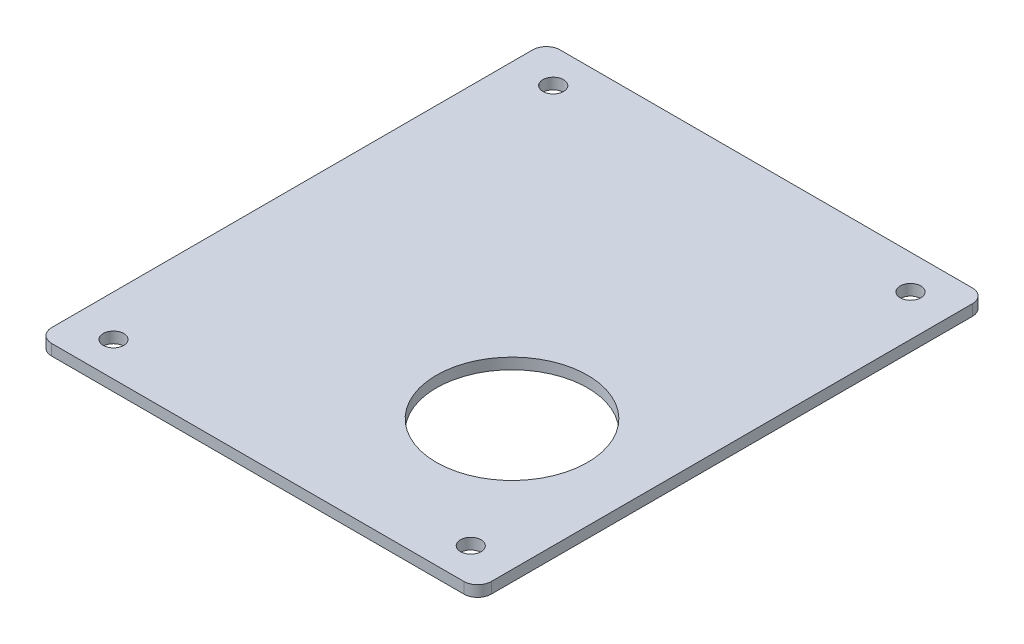
ISO-10303-21;
HEADER;
FILE_DESCRIPTION(('STEP AP214'),'2;1');
FILE_NAME('part.step','',(''),(''),'','','');
FILE_SCHEMA(('AUTOMOTIVE_DESIGN { 1 0 10303 214 1 1 1 1 }'));
ENDSEC;
DATA;
#1=APPLICATION_CONTEXT('core data for automotive mechanical design processes');
#2=APPLICATION_PROTOCOL_DEFINITION('international standard','automotive_design',2000,#1);
#3=PRODUCT_CONTEXT('',#1,'mechanical');
#4=PRODUCT('Part','Part','',(#3));
#5=PRODUCT_RELATED_PRODUCT_CATEGORY('part','',(#4));
#6=PRODUCT_DEFINITION_FORMATION('','',#4);
#7=PRODUCT_DEFINITION_CONTEXT('part definition',#1,'design');
#8=PRODUCT_DEFINITION('design','',#6,#7);
#9=PRODUCT_DEFINITION_SHAPE('','',#8);
#10=(LENGTH_UNIT() NAMED_UNIT(*) SI_UNIT(.MILLI.,.METRE.));
#11=(NAMED_UNIT(*) PLANE_ANGLE_UNIT() SI_UNIT($,.RADIAN.));
#12=(NAMED_UNIT(*) SI_UNIT($,.STERADIAN.) SOLID_ANGLE_UNIT());
#13=UNCERTAINTY_MEASURE_WITH_UNIT(LENGTH_MEASURE(1.E-05),#10,'distance_accuracy_value','');
#14=(GEOMETRIC_REPRESENTATION_CONTEXT(3) GLOBAL_UNCERTAINTY_ASSIGNED_CONTEXT((#13)) GLOBAL_UNIT_ASSIGNED_CONTEXT((#10,
#11,#12)) REPRESENTATION_CONTEXT('',''));
#15=CARTESIAN_POINT('',(0.,0.,0.));
#16=DIRECTION('',(0.,0.,1.));
#17=DIRECTION('',(1.,0.,0.));
#18=AXIS2_PLACEMENT_3D('',#15,#16,#17);
#19=CARTESIAN_POINT('',(0.,1.6,0.));
#20=DIRECTION('',(0.,-1.,0.));
#21=DIRECTION('',(0.,0.,-1.));
#22=AXIS2_PLACEMENT_3D('',#19,#20,#21);
#23=PLANE('',#22);
#24=DIRECTION('',(-1.,0.,0.));
#25=VECTOR('',#24,1.);
#26=CARTESIAN_POINT('',(-32.,1.6,-37.));
#27=LINE('',#26,#25);
#28=CARTESIAN_POINT('',(30.,1.6,-37.));
#29=VERTEX_POINT('',#28);
#30=CARTESIAN_POINT('',(-30.,1.6,-37.));
#31=VERTEX_POINT('',#30);
#32=EDGE_CURVE('E179',#29,#31,#27,.T.);
#33=ORIENTED_EDGE('',*,*,#32,.T.);
#34=CARTESIAN_POINT('',(-30.,1.6,-35.));
#35=DIRECTION('',(0.,-1.,0.));
#36=DIRECTION('',(0.,0.,-1.));
#37=AXIS2_PLACEMENT_3D('',#34,#35,#36);
#38=CIRCLE('',#37,2.);
#39=CARTESIAN_POINT('',(-32.,1.6,-35.));
#40=VERTEX_POINT('',#39);
#41=EDGE_CURVE('E156',#31,#40,#38,.F.);
#42=ORIENTED_EDGE('',*,*,#41,.T.);
#43=DIRECTION('',(0.,0.,1.));
#44=VECTOR('',#43,1.);
#45=CARTESIAN_POINT('',(-32.,1.6,37.));
#46=LINE('',#45,#44);
#47=CARTESIAN_POINT('',(-32.,1.6,35.));
#48=VERTEX_POINT('',#47);
#49=EDGE_CURVE('E126',#40,#48,#46,.T.);
#50=ORIENTED_EDGE('',*,*,#49,.T.);
#51=CARTESIAN_POINT('',(-30.,1.6,35.));
#52=DIRECTION('',(0.,-1.,0.));
#53=DIRECTION('',(0.,0.,-1.));
#54=AXIS2_PLACEMENT_3D('',#51,#52,#53);
#55=CIRCLE('',#54,2.);
#56=CARTESIAN_POINT('',(-30.,1.6,37.));
#57=VERTEX_POINT('',#56);
#58=EDGE_CURVE('E63',#48,#57,#55,.F.);
#59=ORIENTED_EDGE('',*,*,#58,.T.);
#60=DIRECTION('',(1.,0.,0.));
#61=VECTOR('',#60,1.);
#62=CARTESIAN_POINT('',(-32.,1.6,37.));
#63=LINE('',#62,#61);
#64=CARTESIAN_POINT('',(30.,1.6,37.));
#65=VERTEX_POINT('',#64);
#66=EDGE_CURVE('E142',#57,#65,#63,.T.);
#67=ORIENTED_EDGE('',*,*,#66,.T.);
#68=CARTESIAN_POINT('',(30.,1.6,35.));
#69=DIRECTION('',(0.,-1.,0.));
#70=DIRECTION('',(0.,0.,-1.));
#71=AXIS2_PLACEMENT_3D('',#68,#69,#70);
#72=CIRCLE('',#71,2.);
#73=CARTESIAN_POINT('',(32.,1.6,35.));
#74=VERTEX_POINT('',#73);
#75=EDGE_CURVE('E151',#65,#74,#72,.F.);
#76=ORIENTED_EDGE('',*,*,#75,.T.);
#77=DIRECTION('',(0.,0.,-1.));
#78=VECTOR('',#77,1.);
#79=CARTESIAN_POINT('',(32.,1.6,37.));
#80=LINE('',#79,#78);
#81=CARTESIAN_POINT('',(32.,1.6,-35.));
#82=VERTEX_POINT('',#81);
#83=EDGE_CURVE('E136',#74,#82,#80,.T.);
#84=ORIENTED_EDGE('',*,*,#83,.T.);
#85=CARTESIAN_POINT('',(30.,1.6,-35.));
#86=DIRECTION('',(0.,-1.,0.));
#87=DIRECTION('',(0.,0.,-1.));
#88=AXIS2_PLACEMENT_3D('',#85,#86,#87);
#89=CIRCLE('',#88,2.);
#90=EDGE_CURVE('E153',#82,#29,#89,.F.);
#91=ORIENTED_EDGE('',*,*,#90,.T.);
#92=EDGE_LOOP('',(#33,#42,#50,#59,#67,#76,#84,#91));
#93=FACE_BOUND('',#92,.T.);
#94=CARTESIAN_POINT('',(26.,1.6,-32.));
#95=DIRECTION('',(0.,1.,0.));
#96=DIRECTION('',(0.,0.,1.));
#97=AXIS2_PLACEMENT_3D('',#94,#95,#96);
#98=CIRCLE('',#97,1.50000000000001);
#99=CARTESIAN_POINT('',(26.,1.6,-30.5));
#100=VERTEX_POINT('',#99);
#101=EDGE_CURVE('E172',#100,#100,#98,.T.);
#102=ORIENTED_EDGE('',*,*,#101,.F.);
#103=EDGE_LOOP('',(#102));
#104=FACE_BOUND('',#103,.T.);
#105=CARTESIAN_POINT('',(26.,1.6,32.));
#106=DIRECTION('',(0.,1.,0.));
#107=DIRECTION('',(0.,0.,-1.));
#108=AXIS2_PLACEMENT_3D('',#105,#106,#107);
#109=CIRCLE('',#108,1.50000000000001);
#110=CARTESIAN_POINT('',(26.,1.6,30.5));
#111=VERTEX_POINT('',#110);
#112=EDGE_CURVE('E184',#111,#111,#109,.T.);
#113=ORIENTED_EDGE('',*,*,#112,.F.);
#114=EDGE_LOOP('',(#113));
#115=FACE_BOUND('',#114,.T.);
#116=CARTESIAN_POINT('',(-26.,1.6,32.));
#117=DIRECTION('',(0.,1.,0.));
#118=DIRECTION('',(0.,0.,1.));
#119=AXIS2_PLACEMENT_3D('',#116,#117,#118);
#120=CIRCLE('',#119,1.5);
#121=CARTESIAN_POINT('',(-26.,1.6,33.5));
#122=VERTEX_POINT('',#121);
#123=EDGE_CURVE('E189',#122,#122,#120,.T.);
#124=ORIENTED_EDGE('',*,*,#123,.F.);
#125=EDGE_LOOP('',(#124));
#126=FACE_BOUND('',#125,.T.);
#127=CARTESIAN_POINT('',(-26.,1.6,-32.));
#128=DIRECTION('',(0.,1.,0.));
#129=DIRECTION('',(0.,0.,-1.));
#130=AXIS2_PLACEMENT_3D('',#127,#128,#129);
#131=CIRCLE('',#130,1.5);
#132=CARTESIAN_POINT('',(-26.,1.6,-33.5));
#133=VERTEX_POINT('',#132);
#134=EDGE_CURVE('E195',#133,#133,#131,.T.);
#135=ORIENTED_EDGE('',*,*,#134,.F.);
#136=EDGE_LOOP('',(#135));
#137=FACE_BOUND('',#136,.T.);
#138=CARTESIAN_POINT('',(13.,1.6,13.));
#139=DIRECTION('',(0.,1.,0.));
#140=DIRECTION('',(0.,0.,1.));
#141=AXIS2_PLACEMENT_3D('',#138,#139,#140);
#142=CIRCLE('',#141,11.);
#143=CARTESIAN_POINT('',(13.,1.6,24.));
#144=VERTEX_POINT('',#143);
#145=EDGE_CURVE('E201',#144,#144,#142,.T.);
#146=ORIENTED_EDGE('',*,*,#145,.F.);
#147=EDGE_LOOP('',(#146));
#148=FACE_BOUND('',#147,.T.);
#149=ADVANCED_FACE('F41',(#93,#104,#115,#126,#137,#148),#23,.F.);
#150=CARTESIAN_POINT('',(0.,0.,0.));
#151=DIRECTION('',(0.,-1.,0.));
#152=DIRECTION('',(0.,0.,-1.));
#153=AXIS2_PLACEMENT_3D('',#150,#151,#152);
#154=PLANE('',#153);
#155=CARTESIAN_POINT('',(-26.,0.,-32.));
#156=DIRECTION('',(0.,1.,0.));
#157=DIRECTION('',(0.,0.,-1.));
#158=AXIS2_PLACEMENT_3D('',#155,#156,#157);
#159=CIRCLE('',#158,1.5);
#160=CARTESIAN_POINT('',(-26.,0.,-33.5));
#161=VERTEX_POINT('',#160);
#162=EDGE_CURVE('E198',#161,#161,#159,.T.);
#163=ORIENTED_EDGE('',*,*,#162,.T.);
#164=EDGE_LOOP('',(#163));
#165=FACE_BOUND('',#164,.T.);
#166=CARTESIAN_POINT('',(26.,0.,32.));
#167=DIRECTION('',(0.,1.,0.));
#168=DIRECTION('',(0.,0.,-1.));
#169=AXIS2_PLACEMENT_3D('',#166,#167,#168);
#170=CIRCLE('',#169,1.50000000000001);
#171=CARTESIAN_POINT('',(26.,0.,30.5));
#172=VERTEX_POINT('',#171);
#173=EDGE_CURVE('E186',#172,#172,#170,.T.);
#174=ORIENTED_EDGE('',*,*,#173,.T.);
#175=EDGE_LOOP('',(#174));
#176=FACE_BOUND('',#175,.T.);
#177=DIRECTION('',(0.,0.,1.));
#178=VECTOR('',#177,1.);
#179=CARTESIAN_POINT('',(-32.,0.,37.));
#180=LINE('',#179,#178);
#181=CARTESIAN_POINT('',(-32.,0.,-35.));
#182=VERTEX_POINT('',#181);
#183=CARTESIAN_POINT('',(-32.,0.,35.));
#184=VERTEX_POINT('',#183);
#185=EDGE_CURVE('E124',#182,#184,#180,.T.);
#186=ORIENTED_EDGE('',*,*,#185,.F.);
#187=CARTESIAN_POINT('',(-30.,0.,-35.));
#188=DIRECTION('',(0.,-1.,0.));
#189=DIRECTION('',(0.,0.,-1.));
#190=AXIS2_PLACEMENT_3D('',#187,#188,#189);
#191=CIRCLE('',#190,2.);
#192=CARTESIAN_POINT('',(-30.,0.,-37.));
#193=VERTEX_POINT('',#192);
#194=EDGE_CURVE('E107',#182,#193,#191,.T.);
#195=ORIENTED_EDGE('',*,*,#194,.T.);
#196=DIRECTION('',(-1.,0.,0.));
#197=VECTOR('',#196,1.);
#198=CARTESIAN_POINT('',(-32.,0.,-37.));
#199=LINE('',#198,#197);
#200=CARTESIAN_POINT('',(30.,0.,-37.));
#201=VERTEX_POINT('',#200);
#202=EDGE_CURVE('E134',#201,#193,#199,.T.);
#203=ORIENTED_EDGE('',*,*,#202,.F.);
#204=CARTESIAN_POINT('',(30.,0.,-35.));
#205=DIRECTION('',(0.,-1.,0.));
#206=DIRECTION('',(0.,0.,-1.));
#207=AXIS2_PLACEMENT_3D('',#204,#205,#206);
#208=CIRCLE('',#207,2.);
#209=CARTESIAN_POINT('',(32.,0.,-35.));
#210=VERTEX_POINT('',#209);
#211=EDGE_CURVE('E145',#201,#210,#208,.T.);
#212=ORIENTED_EDGE('',*,*,#211,.T.);
#213=DIRECTION('',(0.,0.,-1.));
#214=VECTOR('',#213,1.);
#215=CARTESIAN_POINT('',(32.,0.,37.));
#216=LINE('',#215,#214);
#217=CARTESIAN_POINT('',(32.,0.,35.));
#218=VERTEX_POINT('',#217);
#219=EDGE_CURVE('E138',#218,#210,#216,.T.);
#220=ORIENTED_EDGE('',*,*,#219,.F.);
#221=CARTESIAN_POINT('',(30.,0.,35.));
#222=DIRECTION('',(0.,-1.,0.));
#223=DIRECTION('',(0.,0.,-1.));
#224=AXIS2_PLACEMENT_3D('',#221,#222,#223);
#225=CIRCLE('',#224,2.);
#226=CARTESIAN_POINT('',(30.,0.,37.));
#227=VERTEX_POINT('',#226);
#228=EDGE_CURVE('E127',#218,#227,#225,.T.);
#229=ORIENTED_EDGE('',*,*,#228,.T.);
#230=DIRECTION('',(1.,0.,0.));
#231=VECTOR('',#230,1.);
#232=CARTESIAN_POINT('',(-32.,0.,37.));
#233=LINE('',#232,#231);
#234=CARTESIAN_POINT('',(-30.,0.,37.));
#235=VERTEX_POINT('',#234);
#236=EDGE_CURVE('E133',#235,#227,#233,.T.);
#237=ORIENTED_EDGE('',*,*,#236,.F.);
#238=CARTESIAN_POINT('',(-30.,0.,35.));
#239=DIRECTION('',(0.,-1.,0.));
#240=DIRECTION('',(0.,0.,-1.));
#241=AXIS2_PLACEMENT_3D('',#238,#239,#240);
#242=CIRCLE('',#241,2.);
#243=EDGE_CURVE('E118',#235,#184,#242,.T.);
#244=ORIENTED_EDGE('',*,*,#243,.T.);
#245=EDGE_LOOP('',(#186,#195,#203,#212,#220,#229,#237,#244));
#246=FACE_BOUND('',#245,.T.);
#247=CARTESIAN_POINT('',(26.,0.,-32.));
#248=DIRECTION('',(0.,1.,0.));
#249=DIRECTION('',(0.,0.,1.));
#250=AXIS2_PLACEMENT_3D('',#247,#248,#249);
#251=CIRCLE('',#250,1.50000000000001);
#252=CARTESIAN_POINT('',(26.,0.,-30.5));
#253=VERTEX_POINT('',#252);
#254=EDGE_CURVE('E174',#253,#253,#251,.T.);
#255=ORIENTED_EDGE('',*,*,#254,.T.);
#256=EDGE_LOOP('',(#255));
#257=FACE_BOUND('',#256,.T.);
#258=CARTESIAN_POINT('',(-26.,0.,32.));
#259=DIRECTION('',(0.,1.,0.));
#260=DIRECTION('',(0.,0.,1.));
#261=AXIS2_PLACEMENT_3D('',#258,#259,#260);
#262=CIRCLE('',#261,1.5);
#263=CARTESIAN_POINT('',(-26.,0.,33.5));
#264=VERTEX_POINT('',#263);
#265=EDGE_CURVE('E192',#264,#264,#262,.T.);
#266=ORIENTED_EDGE('',*,*,#265,.T.);
#267=EDGE_LOOP('',(#266));
#268=FACE_BOUND('',#267,.T.);
#269=CARTESIAN_POINT('',(13.,0.,13.));
#270=DIRECTION('',(0.,1.,0.));
#271=DIRECTION('',(0.,0.,1.));
#272=AXIS2_PLACEMENT_3D('',#269,#270,#271);
#273=CIRCLE('',#272,11.);
#274=CARTESIAN_POINT('',(13.,0.,24.));
#275=VERTEX_POINT('',#274);
#276=EDGE_CURVE('E204',#275,#275,#273,.T.);
#277=ORIENTED_EDGE('',*,*,#276,.T.);
#278=EDGE_LOOP('',(#277));
#279=FACE_BOUND('',#278,.T.);
#280=ADVANCED_FACE('F130',(#165,#176,#246,#257,#268,#279),#154,.T.);
#281=CARTESIAN_POINT('',(32.,1.6,37.));
#282=DIRECTION('',(-1.,0.,0.));
#283=DIRECTION('',(0.,0.,1.));
#284=AXIS2_PLACEMENT_3D('',#281,#282,#283);
#285=PLANE('',#284);
#286=ORIENTED_EDGE('',*,*,#219,.T.);
#287=DIRECTION('',(0.,-1.,0.));
#288=VECTOR('',#287,1.);
#289=CARTESIAN_POINT('',(32.,1.6,-35.));
#290=LINE('',#289,#288);
#291=EDGE_CURVE('E11',#210,#82,#290,.F.);
#292=ORIENTED_EDGE('',*,*,#291,.T.);
#293=ORIENTED_EDGE('',*,*,#83,.F.);
#294=DIRECTION('',(0.,-1.,0.));
#295=VECTOR('',#294,1.);
#296=CARTESIAN_POINT('',(32.,1.6,35.));
#297=LINE('',#296,#295);
#298=EDGE_CURVE('E49',#74,#218,#297,.T.);
#299=ORIENTED_EDGE('',*,*,#298,.T.);
#300=EDGE_LOOP('',(#286,#292,#293,#299));
#301=FACE_BOUND('',#300,.T.);
#302=ADVANCED_FACE('F167',(#301),#285,.F.);
#303=CARTESIAN_POINT('',(-32.,1.6,-37.));
#304=DIRECTION('',(0.,0.,1.));
#305=DIRECTION('',(1.,0.,0.));
#306=AXIS2_PLACEMENT_3D('',#303,#304,#305);
#307=PLANE('',#306);
#308=ORIENTED_EDGE('',*,*,#202,.T.);
#309=DIRECTION('',(0.,-1.,0.));
#310=VECTOR('',#309,1.);
#311=CARTESIAN_POINT('',(-30.,1.6,-37.));
#312=LINE('',#311,#310);
#313=EDGE_CURVE('E112',#193,#31,#312,.F.);
#314=ORIENTED_EDGE('',*,*,#313,.T.);
#315=ORIENTED_EDGE('',*,*,#32,.F.);
#316=DIRECTION('',(0.,-1.,0.));
#317=VECTOR('',#316,1.);
#318=CARTESIAN_POINT('',(30.,1.6,-37.));
#319=LINE('',#318,#317);
#320=EDGE_CURVE('E117',#29,#201,#319,.T.);
#321=ORIENTED_EDGE('',*,*,#320,.T.);
#322=EDGE_LOOP('',(#308,#314,#315,#321));
#323=FACE_BOUND('',#322,.T.);
#324=ADVANCED_FACE('F231',(#323),#307,.F.);
#325=CARTESIAN_POINT('',(-32.,1.6,37.));
#326=DIRECTION('',(1.,0.,0.));
#327=DIRECTION('',(0.,0.,-1.));
#328=AXIS2_PLACEMENT_3D('',#325,#326,#327);
#329=PLANE('',#328);
#330=ORIENTED_EDGE('',*,*,#49,.F.);
#331=DIRECTION('',(0.,-1.,0.));
#332=VECTOR('',#331,1.);
#333=CARTESIAN_POINT('',(-32.,1.6,-35.));
#334=LINE('',#333,#332);
#335=EDGE_CURVE('E111',#40,#182,#334,.T.);
#336=ORIENTED_EDGE('',*,*,#335,.T.);
#337=ORIENTED_EDGE('',*,*,#185,.T.);
#338=DIRECTION('',(0.,-1.,0.));
#339=VECTOR('',#338,1.);
#340=CARTESIAN_POINT('',(-32.,1.6,35.));
#341=LINE('',#340,#339);
#342=EDGE_CURVE('E128',#184,#48,#341,.F.);
#343=ORIENTED_EDGE('',*,*,#342,.T.);
#344=EDGE_LOOP('',(#330,#336,#337,#343));
#345=FACE_BOUND('',#344,.T.);
#346=ADVANCED_FACE('F123',(#345),#329,.F.);
#347=CARTESIAN_POINT('',(-32.,1.6,37.));
#348=DIRECTION('',(0.,0.,-1.));
#349=DIRECTION('',(-1.,0.,0.));
#350=AXIS2_PLACEMENT_3D('',#347,#348,#349);
#351=PLANE('',#350);
#352=ORIENTED_EDGE('',*,*,#66,.F.);
#353=DIRECTION('',(0.,-1.,0.));
#354=VECTOR('',#353,1.);
#355=CARTESIAN_POINT('',(-30.,1.6,37.));
#356=LINE('',#355,#354);
#357=EDGE_CURVE('E159',#57,#235,#356,.T.);
#358=ORIENTED_EDGE('',*,*,#357,.T.);
#359=ORIENTED_EDGE('',*,*,#236,.T.);
#360=DIRECTION('',(0.,-1.,0.));
#361=VECTOR('',#360,1.);
#362=CARTESIAN_POINT('',(30.,1.6,37.));
#363=LINE('',#362,#361);
#364=EDGE_CURVE('E56',#227,#65,#363,.F.);
#365=ORIENTED_EDGE('',*,*,#364,.T.);
#366=EDGE_LOOP('',(#352,#358,#359,#365));
#367=FACE_BOUND('',#366,.T.);
#368=ADVANCED_FACE('F226',(#367),#351,.F.);
#369=CARTESIAN_POINT('',(26.,1.6,-32.));
#370=DIRECTION('',(0.,-1.,0.));
#371=DIRECTION('',(0.,0.,-1.));
#372=AXIS2_PLACEMENT_3D('',#369,#370,#371);
#373=CYLINDRICAL_SURFACE('',#372,1.50000000000001);
#374=ORIENTED_EDGE('',*,*,#101,.T.);
#375=EDGE_LOOP('',(#374));
#376=FACE_BOUND('',#375,.T.);
#377=ORIENTED_EDGE('',*,*,#254,.F.);
#378=EDGE_LOOP('',(#377));
#379=FACE_BOUND('',#378,.T.);
#380=ADVANCED_FACE('F223',(#376,#379),#373,.F.);
#381=CARTESIAN_POINT('',(26.,1.6,32.));
#382=DIRECTION('',(0.,-1.,0.));
#383=DIRECTION('',(0.,0.,-1.));
#384=AXIS2_PLACEMENT_3D('',#381,#382,#383);
#385=CYLINDRICAL_SURFACE('',#384,1.50000000000001);
#386=ORIENTED_EDGE('',*,*,#112,.T.);
#387=EDGE_LOOP('',(#386));
#388=FACE_BOUND('',#387,.T.);
#389=ORIENTED_EDGE('',*,*,#173,.F.);
#390=EDGE_LOOP('',(#389));
#391=FACE_BOUND('',#390,.T.);
#392=ADVANCED_FACE('F298',(#388,#391),#385,.F.);
#393=CARTESIAN_POINT('',(-26.,1.6,32.));
#394=DIRECTION('',(0.,-1.,0.));
#395=DIRECTION('',(0.,0.,-1.));
#396=AXIS2_PLACEMENT_3D('',#393,#394,#395);
#397=CYLINDRICAL_SURFACE('',#396,1.5);
#398=ORIENTED_EDGE('',*,*,#123,.T.);
#399=EDGE_LOOP('',(#398));
#400=FACE_BOUND('',#399,.T.);
#401=ORIENTED_EDGE('',*,*,#265,.F.);
#402=EDGE_LOOP('',(#401));
#403=FACE_BOUND('',#402,.T.);
#404=ADVANCED_FACE('F288',(#400,#403),#397,.F.);
#405=CARTESIAN_POINT('',(-26.,1.6,-32.));
#406=DIRECTION('',(0.,-1.,0.));
#407=DIRECTION('',(0.,0.,-1.));
#408=AXIS2_PLACEMENT_3D('',#405,#406,#407);
#409=CYLINDRICAL_SURFACE('',#408,1.5);
#410=ORIENTED_EDGE('',*,*,#134,.T.);
#411=EDGE_LOOP('',(#410));
#412=FACE_BOUND('',#411,.T.);
#413=ORIENTED_EDGE('',*,*,#162,.F.);
#414=EDGE_LOOP('',(#413));
#415=FACE_BOUND('',#414,.T.);
#416=ADVANCED_FACE('F279',(#412,#415),#409,.F.);
#417=CARTESIAN_POINT('',(13.,1.6,13.));
#418=DIRECTION('',(0.,-1.,0.));
#419=DIRECTION('',(0.,0.,-1.));
#420=AXIS2_PLACEMENT_3D('',#417,#418,#419);
#421=CYLINDRICAL_SURFACE('',#420,11.);
#422=ORIENTED_EDGE('',*,*,#145,.T.);
#423=EDGE_LOOP('',(#422));
#424=FACE_BOUND('',#423,.T.);
#425=ORIENTED_EDGE('',*,*,#276,.F.);
#426=EDGE_LOOP('',(#425));
#427=FACE_BOUND('',#426,.T.);
#428=ADVANCED_FACE('F210',(#424,#427),#421,.F.);
#429=CARTESIAN_POINT('',(-30.,1.6,-35.));
#430=DIRECTION('',(0.,-1.,0.));
#431=DIRECTION('',(0.,0.,-1.));
#432=AXIS2_PLACEMENT_3D('',#429,#430,#431);
#433=CYLINDRICAL_SURFACE('',#432,2.);
#434=ORIENTED_EDGE('',*,*,#41,.F.);
#435=ORIENTED_EDGE('',*,*,#313,.F.);
#436=ORIENTED_EDGE('',*,*,#194,.F.);
#437=ORIENTED_EDGE('',*,*,#335,.F.);
#438=EDGE_LOOP('',(#434,#435,#436,#437));
#439=FACE_BOUND('',#438,.T.);
#440=ADVANCED_FACE('F110',(#439),#433,.T.);
#441=CARTESIAN_POINT('',(-30.,1.6,35.));
#442=DIRECTION('',(0.,-1.,0.));
#443=DIRECTION('',(0.,0.,-1.));
#444=AXIS2_PLACEMENT_3D('',#441,#442,#443);
#445=CYLINDRICAL_SURFACE('',#444,2.);
#446=ORIENTED_EDGE('',*,*,#58,.F.);
#447=ORIENTED_EDGE('',*,*,#342,.F.);
#448=ORIENTED_EDGE('',*,*,#243,.F.);
#449=ORIENTED_EDGE('',*,*,#357,.F.);
#450=EDGE_LOOP('',(#446,#447,#448,#449));
#451=FACE_BOUND('',#450,.T.);
#452=ADVANCED_FACE('F239',(#451),#445,.T.);
#453=CARTESIAN_POINT('',(30.,1.6,-35.));
#454=DIRECTION('',(0.,-1.,0.));
#455=DIRECTION('',(0.,0.,-1.));
#456=AXIS2_PLACEMENT_3D('',#453,#454,#455);
#457=CYLINDRICAL_SURFACE('',#456,2.);
#458=ORIENTED_EDGE('',*,*,#90,.F.);
#459=ORIENTED_EDGE('',*,*,#291,.F.);
#460=ORIENTED_EDGE('',*,*,#211,.F.);
#461=ORIENTED_EDGE('',*,*,#320,.F.);
#462=EDGE_LOOP('',(#458,#459,#460,#461));
#463=FACE_BOUND('',#462,.T.);
#464=ADVANCED_FACE('F241',(#463),#457,.T.);
#465=CARTESIAN_POINT('',(30.,1.6,35.));
#466=DIRECTION('',(0.,-1.,0.));
#467=DIRECTION('',(0.,0.,-1.));
#468=AXIS2_PLACEMENT_3D('',#465,#466,#467);
#469=CYLINDRICAL_SURFACE('',#468,2.);
#470=ORIENTED_EDGE('',*,*,#75,.F.);
#471=ORIENTED_EDGE('',*,*,#364,.F.);
#472=ORIENTED_EDGE('',*,*,#228,.F.);
#473=ORIENTED_EDGE('',*,*,#298,.F.);
#474=EDGE_LOOP('',(#470,#471,#472,#473));
#475=FACE_BOUND('',#474,.T.);
#476=ADVANCED_FACE('F43',(#475),#469,.T.);
#477=CLOSED_SHELL('',(#149,#280,#302,#324,#346,#368,#380,#392,#404,#416,#428,#440,#452,#464,#476));
#478=MANIFOLD_SOLID_BREP('B2',#477);
#479=ADVANCED_BREP_SHAPE_REPRESENTATION('',(#18,#478),#14);
#480=SHAPE_DEFINITION_REPRESENTATION(#9,#479);
ENDSEC;
END-ISO-10303-21;
